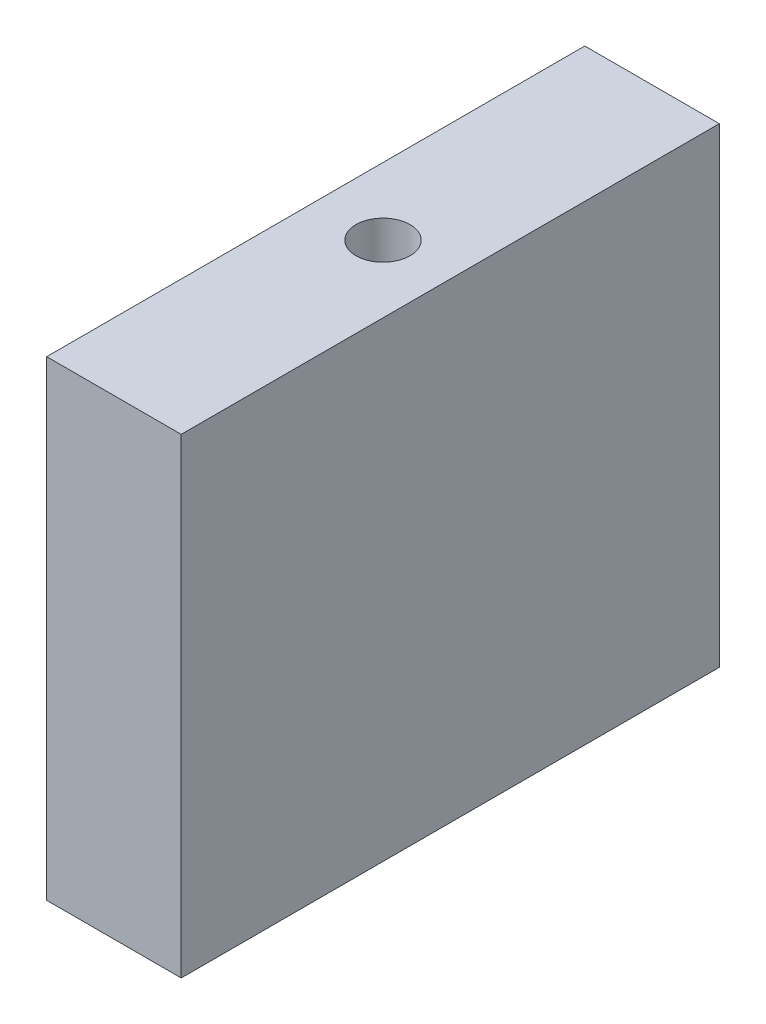
ISO-10303-21;
HEADER;
FILE_DESCRIPTION(('STEP AP214'),'2;1');
FILE_NAME('part.step','',(''),(''),'','','');
FILE_SCHEMA(('AUTOMOTIVE_DESIGN { 1 0 10303 214 1 1 1 1 }'));
ENDSEC;
DATA;
#1=APPLICATION_CONTEXT('core data for automotive mechanical design processes');
#2=APPLICATION_PROTOCOL_DEFINITION('international standard','automotive_design',2000,#1);
#3=PRODUCT_CONTEXT('',#1,'mechanical');
#4=PRODUCT('Part','Part','',(#3));
#5=PRODUCT_RELATED_PRODUCT_CATEGORY('part','',(#4));
#6=PRODUCT_DEFINITION_FORMATION('','',#4);
#7=PRODUCT_DEFINITION_CONTEXT('part definition',#1,'design');
#8=PRODUCT_DEFINITION('design','',#6,#7);
#9=PRODUCT_DEFINITION_SHAPE('','',#8);
#10=(LENGTH_UNIT() NAMED_UNIT(*) SI_UNIT(.MILLI.,.METRE.));
#11=(NAMED_UNIT(*) PLANE_ANGLE_UNIT() SI_UNIT($,.RADIAN.));
#12=(NAMED_UNIT(*) SI_UNIT($,.STERADIAN.) SOLID_ANGLE_UNIT());
#13=UNCERTAINTY_MEASURE_WITH_UNIT(LENGTH_MEASURE(1.E-05),#10,'distance_accuracy_value','');
#14=(GEOMETRIC_REPRESENTATION_CONTEXT(3) GLOBAL_UNCERTAINTY_ASSIGNED_CONTEXT((#13)) GLOBAL_UNIT_ASSIGNED_CONTEXT((#10,
#11,#12)) REPRESENTATION_CONTEXT('',''));
#15=CARTESIAN_POINT('',(0.,0.,0.));
#16=DIRECTION('',(0.,0.,1.));
#17=DIRECTION('',(1.,0.,0.));
#18=AXIS2_PLACEMENT_3D('',#15,#16,#17);
#19=CARTESIAN_POINT('',(6.34999999999997,25.4,34.925));
#20=DIRECTION('',(0.,0.,-1.));
#21=DIRECTION('',(0.,1.,0.));
#22=AXIS2_PLACEMENT_3D('',#19,#20,#21);
#23=PLANE('',#22);
#24=DIRECTION('',(0.,-1.,0.));
#25=VECTOR('',#24,1.);
#26=CARTESIAN_POINT('',(-6.34999999999997,25.4,34.925));
#27=LINE('',#26,#25);
#28=CARTESIAN_POINT('',(-6.34999999999997,25.4,34.925));
#29=VERTEX_POINT('',#28);
#30=CARTESIAN_POINT('',(-6.34999999999997,-19.05,34.925));
#31=VERTEX_POINT('',#30);
#32=EDGE_CURVE('E128',#29,#31,#27,.T.);
#33=ORIENTED_EDGE('',*,*,#32,.T.);
#34=DIRECTION('',(-1.,0.,0.));
#35=VECTOR('',#34,1.);
#36=CARTESIAN_POINT('',(6.34999999999997,-19.05,34.925));
#37=LINE('',#36,#35);
#38=CARTESIAN_POINT('',(6.34999999999997,-19.05,34.925));
#39=VERTEX_POINT('',#38);
#40=EDGE_CURVE('E11',#39,#31,#37,.T.);
#41=ORIENTED_EDGE('',*,*,#40,.F.);
#42=DIRECTION('',(0.,-1.,0.));
#43=VECTOR('',#42,1.);
#44=CARTESIAN_POINT('',(6.34999999999997,25.4,34.925));
#45=LINE('',#44,#43);
#46=CARTESIAN_POINT('',(6.34999999999997,25.4,34.925));
#47=VERTEX_POINT('',#46);
#48=EDGE_CURVE('E129',#47,#39,#45,.T.);
#49=ORIENTED_EDGE('',*,*,#48,.F.);
#50=DIRECTION('',(-1.,0.,0.));
#51=VECTOR('',#50,1.);
#52=CARTESIAN_POINT('',(6.34999999999997,25.4,34.925));
#53=LINE('',#52,#51);
#54=EDGE_CURVE('E135',#47,#29,#53,.T.);
#55=ORIENTED_EDGE('',*,*,#54,.T.);
#56=EDGE_LOOP('',(#33,#41,#49,#55));
#57=FACE_BOUND('',#56,.T.);
#58=ADVANCED_FACE('F38',(#57),#23,.F.);
#59=CARTESIAN_POINT('',(6.34999999999997,-19.05,34.925));
#60=DIRECTION('',(0.,1.,0.));
#61=DIRECTION('',(0.,0.,1.));
#62=AXIS2_PLACEMENT_3D('',#59,#60,#61);
#63=PLANE('',#62);
#64=CARTESIAN_POINT('',(0.,-19.05,26.035));
#65=DIRECTION('',(0.,-1.,0.));
#66=DIRECTION('',(0.,0.,-1.));
#67=AXIS2_PLACEMENT_3D('',#64,#65,#66);
#68=CIRCLE('',#67,4.1656);
#69=CARTESIAN_POINT('',(0.,-19.05,21.8694));
#70=VERTEX_POINT('',#69);
#71=EDGE_CURVE('E105',#70,#70,#68,.T.);
#72=ORIENTED_EDGE('',*,*,#71,.F.);
#73=EDGE_LOOP('',(#72));
#74=FACE_BOUND('',#73,.T.);
#75=CARTESIAN_POINT('',(0.,-19.05,-5.71500000000003));
#76=DIRECTION('',(0.,-1.,0.));
#77=DIRECTION('',(0.,0.,-1.));
#78=AXIS2_PLACEMENT_3D('',#75,#76,#77);
#79=CIRCLE('',#78,4.1656);
#80=CARTESIAN_POINT('',(0.,-19.05,-9.88060000000003));
#81=VERTEX_POINT('',#80);
#82=EDGE_CURVE('E119',#81,#81,#79,.T.);
#83=ORIENTED_EDGE('',*,*,#82,.F.);
#84=EDGE_LOOP('',(#83));
#85=FACE_BOUND('',#84,.T.);
#86=DIRECTION('',(0.,0.,-1.));
#87=VECTOR('',#86,1.);
#88=CARTESIAN_POINT('',(-6.34999999999997,-19.05,34.925));
#89=LINE('',#88,#87);
#90=CARTESIAN_POINT('',(-6.34999999999997,-19.05,-15.875));
#91=VERTEX_POINT('',#90);
#92=EDGE_CURVE('E138',#31,#91,#89,.T.);
#93=ORIENTED_EDGE('',*,*,#92,.T.);
#94=DIRECTION('',(-1.,0.,0.));
#95=VECTOR('',#94,1.);
#96=CARTESIAN_POINT('',(6.34999999999997,-19.05,-15.875));
#97=LINE('',#96,#95);
#98=CARTESIAN_POINT('',(6.34999999999997,-19.05,-15.875));
#99=VERTEX_POINT('',#98);
#100=EDGE_CURVE('E46',#99,#91,#97,.T.);
#101=ORIENTED_EDGE('',*,*,#100,.F.);
#102=DIRECTION('',(0.,0.,-1.));
#103=VECTOR('',#102,1.);
#104=CARTESIAN_POINT('',(6.34999999999997,-19.05,34.925));
#105=LINE('',#104,#103);
#106=EDGE_CURVE('E85',#39,#99,#105,.T.);
#107=ORIENTED_EDGE('',*,*,#106,.F.);
#108=ORIENTED_EDGE('',*,*,#40,.T.);
#109=EDGE_LOOP('',(#93,#101,#107,#108));
#110=FACE_BOUND('',#109,.T.);
#111=ADVANCED_FACE('F162',(#74,#85,#110),#63,.F.);
#112=CARTESIAN_POINT('',(6.34999999999997,25.4,-15.875));
#113=DIRECTION('',(0.,0.,1.));
#114=DIRECTION('',(0.,-1.,0.));
#115=AXIS2_PLACEMENT_3D('',#112,#113,#114);
#116=PLANE('',#115);
#117=DIRECTION('',(0.,1.,0.));
#118=VECTOR('',#117,1.);
#119=CARTESIAN_POINT('',(-6.34999999999997,25.4,-15.875));
#120=LINE('',#119,#118);
#121=CARTESIAN_POINT('',(-6.34999999999997,25.4,-15.875));
#122=VERTEX_POINT('',#121);
#123=EDGE_CURVE('E72',#91,#122,#120,.T.);
#124=ORIENTED_EDGE('',*,*,#123,.T.);
#125=DIRECTION('',(-1.,0.,0.));
#126=VECTOR('',#125,1.);
#127=CARTESIAN_POINT('',(6.34999999999997,25.4,-15.875));
#128=LINE('',#127,#126);
#129=CARTESIAN_POINT('',(6.34999999999997,25.4,-15.875));
#130=VERTEX_POINT('',#129);
#131=EDGE_CURVE('E143',#130,#122,#128,.T.);
#132=ORIENTED_EDGE('',*,*,#131,.F.);
#133=DIRECTION('',(0.,1.,0.));
#134=VECTOR('',#133,1.);
#135=CARTESIAN_POINT('',(6.34999999999997,25.4,-15.875));
#136=LINE('',#135,#134);
#137=EDGE_CURVE('E132',#99,#130,#136,.T.);
#138=ORIENTED_EDGE('',*,*,#137,.F.);
#139=ORIENTED_EDGE('',*,*,#100,.T.);
#140=EDGE_LOOP('',(#124,#132,#138,#139));
#141=FACE_BOUND('',#140,.T.);
#142=ADVANCED_FACE('F145',(#141),#116,.F.);
#143=CARTESIAN_POINT('',(6.34999999999997,25.4,34.925));
#144=DIRECTION('',(0.,-1.,0.));
#145=DIRECTION('',(0.,0.,-1.));
#146=AXIS2_PLACEMENT_3D('',#143,#144,#145);
#147=PLANE('',#146);
#148=CARTESIAN_POINT('',(0.,25.4,9.52500000000001));
#149=DIRECTION('',(0.,1.,0.));
#150=DIRECTION('',(0.,0.,1.));
#151=AXIS2_PLACEMENT_3D('',#148,#149,#150);
#152=CIRCLE('',#151,2.55269999999999);
#153=CARTESIAN_POINT('',(0.,25.4,12.0777));
#154=VERTEX_POINT('',#153);
#155=EDGE_CURVE('E106',#154,#154,#152,.T.);
#156=ORIENTED_EDGE('',*,*,#155,.F.);
#157=EDGE_LOOP('',(#156));
#158=FACE_BOUND('',#157,.T.);
#159=DIRECTION('',(0.,0.,1.));
#160=VECTOR('',#159,1.);
#161=CARTESIAN_POINT('',(-6.34999999999997,25.4,34.925));
#162=LINE('',#161,#160);
#163=EDGE_CURVE('E78',#122,#29,#162,.T.);
#164=ORIENTED_EDGE('',*,*,#163,.T.);
#165=ORIENTED_EDGE('',*,*,#54,.F.);
#166=DIRECTION('',(0.,0.,1.));
#167=VECTOR('',#166,1.);
#168=CARTESIAN_POINT('',(6.34999999999997,25.4,34.925));
#169=LINE('',#168,#167);
#170=EDGE_CURVE('E54',#130,#47,#169,.T.);
#171=ORIENTED_EDGE('',*,*,#170,.F.);
#172=ORIENTED_EDGE('',*,*,#131,.T.);
#173=EDGE_LOOP('',(#164,#165,#171,#172));
#174=FACE_BOUND('',#173,.T.);
#175=ADVANCED_FACE('F152',(#158,#174),#147,.F.);
#176=CARTESIAN_POINT('',(6.34999999999997,-19.05,34.925));
#177=DIRECTION('',(1.,0.,0.));
#178=DIRECTION('',(0.,0.,-1.));
#179=AXIS2_PLACEMENT_3D('',#176,#177,#178);
#180=PLANE('',#179);
#181=ORIENTED_EDGE('',*,*,#48,.T.);
#182=ORIENTED_EDGE('',*,*,#106,.T.);
#183=ORIENTED_EDGE('',*,*,#137,.T.);
#184=ORIENTED_EDGE('',*,*,#170,.T.);
#185=EDGE_LOOP('',(#181,#182,#183,#184));
#186=FACE_BOUND('',#185,.T.);
#187=ADVANCED_FACE('F154',(#186),#180,.T.);
#188=CARTESIAN_POINT('',(-6.34999999999997,-19.05,34.925));
#189=DIRECTION('',(1.,0.,0.));
#190=DIRECTION('',(0.,0.,-1.));
#191=AXIS2_PLACEMENT_3D('',#188,#189,#190);
#192=PLANE('',#191);
#193=ORIENTED_EDGE('',*,*,#32,.F.);
#194=ORIENTED_EDGE('',*,*,#163,.F.);
#195=ORIENTED_EDGE('',*,*,#123,.F.);
#196=ORIENTED_EDGE('',*,*,#92,.F.);
#197=EDGE_LOOP('',(#193,#194,#195,#196));
#198=FACE_BOUND('',#197,.T.);
#199=ADVANCED_FACE('F148',(#198),#192,.F.);
#200=CARTESIAN_POINT('',(0.,-4.1402,-5.71500000000003));
#201=DIRECTION('',(0.,-1.,0.));
#202=DIRECTION('',(0.,0.,-1.));
#203=AXIS2_PLACEMENT_3D('',#200,#201,#202);
#204=CONICAL_SURFACE('',#203,2.5527,1.02974425867665);
#205=CARTESIAN_POINT('',(0.,-2.60638309780833,-5.71500000000003));
#206=VERTEX_POINT('',#205);
#207=VERTEX_LOOP('',#206);
#208=FACE_BOUND('',#207,.T.);
#209=CARTESIAN_POINT('',(0.,-4.1402,-5.71500000000003));
#210=DIRECTION('',(0.,-1.,0.));
#211=DIRECTION('',(0.,0.,-1.));
#212=AXIS2_PLACEMENT_3D('',#209,#210,#211);
#213=CIRCLE('',#212,2.5527);
#214=CARTESIAN_POINT('',(0.,-4.1402,-8.26770000000002));
#215=VERTEX_POINT('',#214);
#216=EDGE_CURVE('E125',#215,#215,#213,.T.);
#217=ORIENTED_EDGE('',*,*,#216,.T.);
#218=EDGE_LOOP('',(#217));
#219=FACE_BOUND('',#218,.T.);
#220=ADVANCED_FACE('F190',(#208,#219),#204,.F.);
#221=CARTESIAN_POINT('',(0.,-19.05,-5.71500000000003));
#222=DIRECTION('',(0.,-1.,0.));
#223=DIRECTION('',(0.,0.,-1.));
#224=AXIS2_PLACEMENT_3D('',#221,#222,#223);
#225=CYLINDRICAL_SURFACE('',#224,2.5527);
#226=ORIENTED_EDGE('',*,*,#216,.F.);
#227=EDGE_LOOP('',(#226));
#228=FACE_BOUND('',#227,.T.);
#229=CARTESIAN_POINT('',(0.,-17.1945707959932,-5.71500000000003));
#230=DIRECTION('',(0.,-1.,0.));
#231=DIRECTION('',(0.,0.,-1.));
#232=AXIS2_PLACEMENT_3D('',#229,#230,#231);
#233=CIRCLE('',#232,2.5527);
#234=CARTESIAN_POINT('',(0.,-17.1945707959932,-8.26770000000002));
#235=VERTEX_POINT('',#234);
#236=EDGE_CURVE('E122',#235,#235,#233,.T.);
#237=ORIENTED_EDGE('',*,*,#236,.T.);
#238=EDGE_LOOP('',(#237));
#239=FACE_BOUND('',#238,.T.);
#240=ADVANCED_FACE('F180',(#228,#239),#225,.F.);
#241=CARTESIAN_POINT('',(0.,-19.05,-5.71500000000003));
#242=DIRECTION('',(0.,-1.,0.));
#243=DIRECTION('',(0.,0.,-1.));
#244=AXIS2_PLACEMENT_3D('',#241,#242,#243);
#245=CONICAL_SURFACE('',#244,4.1656,0.715584993317674);
#246=ORIENTED_EDGE('',*,*,#236,.F.);
#247=EDGE_LOOP('',(#246));
#248=FACE_BOUND('',#247,.T.);
#249=ORIENTED_EDGE('',*,*,#82,.T.);
#250=EDGE_LOOP('',(#249));
#251=FACE_BOUND('',#250,.T.);
#252=ADVANCED_FACE('F177',(#248,#251),#245,.F.);
#253=CARTESIAN_POINT('',(0.,-4.1402,26.035));
#254=DIRECTION('',(0.,-1.,0.));
#255=DIRECTION('',(0.,0.,-1.));
#256=AXIS2_PLACEMENT_3D('',#253,#254,#255);
#257=CONICAL_SURFACE('',#256,2.5527,1.02974425867665);
#258=CARTESIAN_POINT('',(0.,-2.60638309780833,26.035));
#259=VERTEX_POINT('',#258);
#260=VERTEX_LOOP('',#259);
#261=FACE_BOUND('',#260,.T.);
#262=CARTESIAN_POINT('',(0.,-4.1402,26.035));
#263=DIRECTION('',(0.,-1.,0.));
#264=DIRECTION('',(0.,0.,-1.));
#265=AXIS2_PLACEMENT_3D('',#262,#263,#264);
#266=CIRCLE('',#265,2.5527);
#267=CARTESIAN_POINT('',(0.,-4.1402,23.4823));
#268=VERTEX_POINT('',#267);
#269=EDGE_CURVE('E116',#268,#268,#266,.T.);
#270=ORIENTED_EDGE('',*,*,#269,.T.);
#271=EDGE_LOOP('',(#270));
#272=FACE_BOUND('',#271,.T.);
#273=ADVANCED_FACE('F179',(#261,#272),#257,.F.);
#274=CARTESIAN_POINT('',(0.,-19.05,26.035));
#275=DIRECTION('',(0.,-1.,0.));
#276=DIRECTION('',(0.,0.,-1.));
#277=AXIS2_PLACEMENT_3D('',#274,#275,#276);
#278=CYLINDRICAL_SURFACE('',#277,2.5527);
#279=ORIENTED_EDGE('',*,*,#269,.F.);
#280=EDGE_LOOP('',(#279));
#281=FACE_BOUND('',#280,.T.);
#282=CARTESIAN_POINT('',(0.,-17.1945707959932,26.035));
#283=DIRECTION('',(0.,-1.,0.));
#284=DIRECTION('',(0.,0.,-1.));
#285=AXIS2_PLACEMENT_3D('',#282,#283,#284);
#286=CIRCLE('',#285,2.5527);
#287=CARTESIAN_POINT('',(0.,-17.1945707959932,23.4823));
#288=VERTEX_POINT('',#287);
#289=EDGE_CURVE('E109',#288,#288,#286,.T.);
#290=ORIENTED_EDGE('',*,*,#289,.T.);
#291=EDGE_LOOP('',(#290));
#292=FACE_BOUND('',#291,.T.);
#293=ADVANCED_FACE('F187',(#281,#292),#278,.F.);
#294=CARTESIAN_POINT('',(0.,-19.05,26.035));
#295=DIRECTION('',(0.,-1.,0.));
#296=DIRECTION('',(0.,0.,-1.));
#297=AXIS2_PLACEMENT_3D('',#294,#295,#296);
#298=CONICAL_SURFACE('',#297,4.1656,0.715584993317674);
#299=ORIENTED_EDGE('',*,*,#289,.F.);
#300=EDGE_LOOP('',(#299));
#301=FACE_BOUND('',#300,.T.);
#302=ORIENTED_EDGE('',*,*,#71,.T.);
#303=EDGE_LOOP('',(#302));
#304=FACE_BOUND('',#303,.T.);
#305=ADVANCED_FACE('F99',(#301,#304),#298,.F.);
#306=CARTESIAN_POINT('',(0.,8.89000000000001,9.52500000000001));
#307=DIRECTION('',(0.,1.,0.));
#308=DIRECTION('',(0.,0.,1.));
#309=AXIS2_PLACEMENT_3D('',#306,#307,#308);
#310=CONICAL_SURFACE('',#309,2.55269999999999,1.02974425867665);
#311=CARTESIAN_POINT('',(0.,7.35618309780836,9.52500000000001));
#312=VERTEX_POINT('',#311);
#313=VERTEX_LOOP('',#312);
#314=FACE_BOUND('',#313,.T.);
#315=CARTESIAN_POINT('',(0.,8.89000000000001,9.52500000000001));
#316=DIRECTION('',(0.,1.,0.));
#317=DIRECTION('',(0.,0.,1.));
#318=AXIS2_PLACEMENT_3D('',#315,#316,#317);
#319=CIRCLE('',#318,2.55269999999999);
#320=CARTESIAN_POINT('',(0.,8.89000000000001,12.0777));
#321=VERTEX_POINT('',#320);
#322=EDGE_CURVE('E103',#321,#321,#319,.T.);
#323=ORIENTED_EDGE('',*,*,#322,.T.);
#324=EDGE_LOOP('',(#323));
#325=FACE_BOUND('',#324,.T.);
#326=ADVANCED_FACE('F95',(#314,#325),#310,.F.);
#327=CARTESIAN_POINT('',(0.,25.4,9.52500000000001));
#328=DIRECTION('',(0.,1.,0.));
#329=DIRECTION('',(0.,0.,1.));
#330=AXIS2_PLACEMENT_3D('',#327,#328,#329);
#331=CYLINDRICAL_SURFACE('',#330,2.55269999999999);
#332=ORIENTED_EDGE('',*,*,#322,.F.);
#333=EDGE_LOOP('',(#332));
#334=FACE_BOUND('',#333,.T.);
#335=ORIENTED_EDGE('',*,*,#155,.T.);
#336=EDGE_LOOP('',(#335));
#337=FACE_BOUND('',#336,.T.);
#338=ADVANCED_FACE('F98',(#334,#337),#331,.F.);
#339=CLOSED_SHELL('',(#58,#111,#142,#175,#187,#199,#220,#240,#252,#273,#293,#305,#326,#338));
#340=MANIFOLD_SOLID_BREP('B2',#339);
#341=ADVANCED_BREP_SHAPE_REPRESENTATION('',(#18,#340),#14);
#342=SHAPE_DEFINITION_REPRESENTATION(#9,#341);
ENDSEC;
END-ISO-10303-21;
